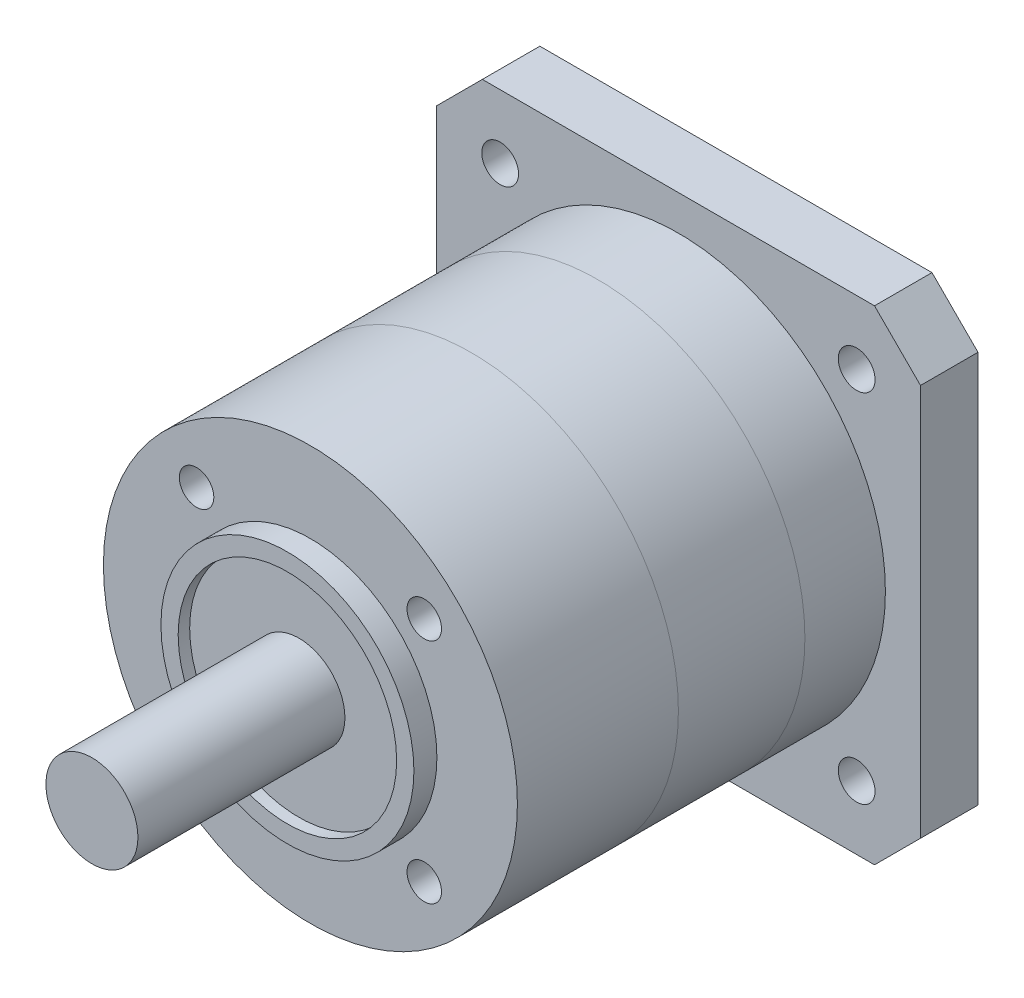
ISO-10303-21;
HEADER;
FILE_DESCRIPTION(('STEP AP214'),'2;1');
FILE_NAME('part.step','',(''),(''),'','','');
FILE_SCHEMA(('AUTOMOTIVE_DESIGN { 1 0 10303 214 1 1 1 1 }'));
ENDSEC;
DATA;
#1=APPLICATION_CONTEXT('core data for automotive mechanical design processes');
#2=APPLICATION_PROTOCOL_DEFINITION('international standard','automotive_design',2000,#1);
#3=PRODUCT_CONTEXT('',#1,'mechanical');
#4=PRODUCT('Part','Part','',(#3));
#5=PRODUCT_RELATED_PRODUCT_CATEGORY('part','',(#4));
#6=PRODUCT_DEFINITION_FORMATION('','',#4);
#7=PRODUCT_DEFINITION_CONTEXT('part definition',#1,'design');
#8=PRODUCT_DEFINITION('design','',#6,#7);
#9=PRODUCT_DEFINITION_SHAPE('','',#8);
#10=(LENGTH_UNIT() NAMED_UNIT(*) SI_UNIT(.MILLI.,.METRE.));
#11=(NAMED_UNIT(*) PLANE_ANGLE_UNIT() SI_UNIT($,.RADIAN.));
#12=(NAMED_UNIT(*) SI_UNIT($,.STERADIAN.) SOLID_ANGLE_UNIT());
#13=UNCERTAINTY_MEASURE_WITH_UNIT(LENGTH_MEASURE(1.E-05),#10,'distance_accuracy_value','');
#14=(GEOMETRIC_REPRESENTATION_CONTEXT(3) GLOBAL_UNCERTAINTY_ASSIGNED_CONTEXT((#13)) GLOBAL_UNIT_ASSIGNED_CONTEXT((#10,
#11,#12)) REPRESENTATION_CONTEXT('',''));
#15=CARTESIAN_POINT('',(0.,0.,0.));
#16=DIRECTION('',(0.,0.,1.));
#17=DIRECTION('',(1.,0.,0.));
#18=AXIS2_PLACEMENT_3D('',#15,#16,#17);
#19=CARTESIAN_POINT('',(0.,0.,56.));
#20=DIRECTION('',(0.,0.,-1.));
#21=DIRECTION('',(-1.,0.,0.));
#22=AXIS2_PLACEMENT_3D('',#19,#20,#21);
#23=CYLINDRICAL_SURFACE('',#22,4.);
#24=CARTESIAN_POINT('',(0.,0.,56.));
#25=DIRECTION('',(0.,0.,1.));
#26=DIRECTION('',(1.,0.,0.));
#27=AXIS2_PLACEMENT_3D('',#24,#25,#26);
#28=CIRCLE('',#27,4.);
#29=CARTESIAN_POINT('',(4.,0.,56.));
#30=VERTEX_POINT('',#29);
#31=EDGE_CURVE('E11',#30,#30,#28,.T.);
#32=ORIENTED_EDGE('',*,*,#31,.F.);
#33=EDGE_LOOP('',(#32));
#34=FACE_BOUND('',#33,.T.);
#35=CARTESIAN_POINT('',(0.,0.,37.));
#36=DIRECTION('',(0.,0.,1.));
#37=DIRECTION('',(1.,0.,0.));
#38=AXIS2_PLACEMENT_3D('',#35,#36,#37);
#39=CIRCLE('',#38,4.);
#40=CARTESIAN_POINT('',(4.,0.,37.));
#41=VERTEX_POINT('',#40);
#42=EDGE_CURVE('E51',#41,#41,#39,.T.);
#43=ORIENTED_EDGE('',*,*,#42,.T.);
#44=EDGE_LOOP('',(#43));
#45=FACE_BOUND('',#44,.T.);
#46=ADVANCED_FACE('F48',(#34,#45),#23,.T.);
#47=CARTESIAN_POINT('',(0.,0.,56.));
#48=DIRECTION('',(0.,0.,1.));
#49=DIRECTION('',(1.,0.,0.));
#50=AXIS2_PLACEMENT_3D('',#47,#48,#49);
#51=PLANE('',#50);
#52=ORIENTED_EDGE('',*,*,#31,.T.);
#53=EDGE_LOOP('',(#52));
#54=FACE_BOUND('',#53,.T.);
#55=ADVANCED_FACE('F63',(#54),#51,.T.);
#56=CARTESIAN_POINT('',(0.,0.,37.));
#57=DIRECTION('',(0.,0.,1.));
#58=DIRECTION('',(1.,0.,0.));
#59=AXIS2_PLACEMENT_3D('',#56,#57,#58);
#60=PLANE('',#59);
#61=ORIENTED_EDGE('',*,*,#42,.F.);
#62=EDGE_LOOP('',(#61));
#63=FACE_BOUND('',#62,.T.);
#64=ADVANCED_FACE('F61',(#63),#60,.F.);
#65=CLOSED_SHELL('',(#46,#55,#64));
#66=MANIFOLD_SOLID_BREP('B2',#65);
#67=CARTESIAN_POINT('',(0.,0.,124.911688245431));
#68=DIRECTION('',(0.,0.,-1.));
#69=DIRECTION('',(-1.,0.,0.));
#70=AXIS2_PLACEMENT_3D('',#67,#68,#69);
#71=CYLINDRICAL_SURFACE('',#70,18.);
#72=CARTESIAN_POINT('',(0.,0.,23.));
#73=DIRECTION('',(0.,0.,1.));
#74=DIRECTION('',(1.,0.,0.));
#75=AXIS2_PLACEMENT_3D('',#72,#73,#74);
#76=CIRCLE('',#75,18.);
#77=CARTESIAN_POINT('',(18.,0.,23.));
#78=VERTEX_POINT('',#77);
#79=EDGE_CURVE('E109',#78,#78,#76,.T.);
#80=ORIENTED_EDGE('',*,*,#79,.T.);
#81=EDGE_LOOP('',(#80));
#82=FACE_BOUND('',#81,.T.);
#83=CARTESIAN_POINT('',(0.,0.,37.));
#84=DIRECTION('',(0.,0.,1.));
#85=DIRECTION('',(1.,0.,0.));
#86=AXIS2_PLACEMENT_3D('',#83,#84,#85);
#87=CIRCLE('',#86,18.);
#88=CARTESIAN_POINT('',(18.,0.,37.));
#89=VERTEX_POINT('',#88);
#90=EDGE_CURVE('E101',#89,#89,#87,.T.);
#91=ORIENTED_EDGE('',*,*,#90,.F.);
#92=EDGE_LOOP('',(#91));
#93=FACE_BOUND('',#92,.T.);
#94=ADVANCED_FACE('F97',(#82,#93),#71,.T.);
#95=CARTESIAN_POINT('',(0.,0.,23.));
#96=DIRECTION('',(0.,0.,1.));
#97=DIRECTION('',(1.,0.,0.));
#98=AXIS2_PLACEMENT_3D('',#95,#96,#97);
#99=PLANE('',#98);
#100=ORIENTED_EDGE('',*,*,#79,.F.);
#101=EDGE_LOOP('',(#100));
#102=FACE_BOUND('',#101,.T.);
#103=ADVANCED_FACE('F164',(#102),#99,.F.);
#104=CARTESIAN_POINT('',(0.,0.,37.));
#105=DIRECTION('',(0.,0.,1.));
#106=DIRECTION('',(1.,0.,0.));
#107=AXIS2_PLACEMENT_3D('',#104,#105,#106);
#108=PLANE('',#107);
#109=CARTESIAN_POINT('',(-9.89949493661172,-9.89949493661161,37.));
#110=DIRECTION('',(0.,0.,1.));
#111=DIRECTION('',(1.,0.,0.));
#112=AXIS2_PLACEMENT_3D('',#109,#110,#111);
#113=CIRCLE('',#112,1.5);
#114=CARTESIAN_POINT('',(-8.39949493661172,-9.89949493661161,37.));
#115=VERTEX_POINT('',#114);
#116=EDGE_CURVE('E134',#115,#115,#113,.T.);
#117=ORIENTED_EDGE('',*,*,#116,.F.);
#118=EDGE_LOOP('',(#117));
#119=FACE_BOUND('',#118,.T.);
#120=CARTESIAN_POINT('',(9.89949493661161,-9.89949493661172,37.));
#121=DIRECTION('',(0.,0.,1.));
#122=DIRECTION('',(1.,0.,0.));
#123=AXIS2_PLACEMENT_3D('',#120,#121,#122);
#124=CIRCLE('',#123,1.5);
#125=CARTESIAN_POINT('',(11.3994949366116,-9.89949493661172,37.));
#126=VERTEX_POINT('',#125);
#127=EDGE_CURVE('E140',#126,#126,#124,.T.);
#128=ORIENTED_EDGE('',*,*,#127,.F.);
#129=EDGE_LOOP('',(#128));
#130=FACE_BOUND('',#129,.T.);
#131=CARTESIAN_POINT('',(9.89949493661172,9.89949493661161,37.));
#132=DIRECTION('',(0.,0.,1.));
#133=DIRECTION('',(1.,0.,0.));
#134=AXIS2_PLACEMENT_3D('',#131,#132,#133);
#135=CIRCLE('',#134,1.5);
#136=CARTESIAN_POINT('',(11.3994949366117,9.89949493661161,37.));
#137=VERTEX_POINT('',#136);
#138=EDGE_CURVE('E146',#137,#137,#135,.T.);
#139=ORIENTED_EDGE('',*,*,#138,.F.);
#140=EDGE_LOOP('',(#139));
#141=FACE_BOUND('',#140,.T.);
#142=CARTESIAN_POINT('',(-9.89949493661161,9.89949493661172,37.));
#143=DIRECTION('',(0.,0.,1.));
#144=DIRECTION('',(1.,0.,0.));
#145=AXIS2_PLACEMENT_3D('',#142,#143,#144);
#146=CIRCLE('',#145,1.5);
#147=CARTESIAN_POINT('',(-8.39949493661161,9.89949493661172,37.));
#148=VERTEX_POINT('',#147);
#149=EDGE_CURVE('E128',#148,#148,#146,.T.);
#150=ORIENTED_EDGE('',*,*,#149,.F.);
#151=EDGE_LOOP('',(#150));
#152=FACE_BOUND('',#151,.T.);
#153=CARTESIAN_POINT('',(0.,0.,37.));
#154=DIRECTION('',(0.,0.,1.));
#155=DIRECTION('',(1.,0.,0.));
#156=AXIS2_PLACEMENT_3D('',#153,#154,#155);
#157=CIRCLE('',#156,11.);
#158=CARTESIAN_POINT('',(11.,0.,37.));
#159=VERTEX_POINT('',#158);
#160=EDGE_CURVE('E47',#159,#159,#157,.T.);
#161=ORIENTED_EDGE('',*,*,#160,.F.);
#162=EDGE_LOOP('',(#161));
#163=FACE_BOUND('',#162,.T.);
#164=ORIENTED_EDGE('',*,*,#90,.T.);
#165=EDGE_LOOP('',(#164));
#166=FACE_BOUND('',#165,.T.);
#167=ADVANCED_FACE('F99',(#119,#130,#141,#152,#163,#166),#108,.T.);
#168=CARTESIAN_POINT('',(0.,0.,39.));
#169=DIRECTION('',(0.,0.,-1.));
#170=DIRECTION('',(-1.,0.,0.));
#171=AXIS2_PLACEMENT_3D('',#168,#169,#170);
#172=CYLINDRICAL_SURFACE('',#171,11.);
#173=CARTESIAN_POINT('',(0.,0.,39.));
#174=DIRECTION('',(0.,0.,1.));
#175=DIRECTION('',(1.,0.,0.));
#176=AXIS2_PLACEMENT_3D('',#173,#174,#175);
#177=CIRCLE('',#176,11.);
#178=CARTESIAN_POINT('',(11.,0.,39.));
#179=VERTEX_POINT('',#178);
#180=EDGE_CURVE('E111',#179,#179,#177,.T.);
#181=ORIENTED_EDGE('',*,*,#180,.F.);
#182=EDGE_LOOP('',(#181));
#183=FACE_BOUND('',#182,.T.);
#184=ORIENTED_EDGE('',*,*,#160,.T.);
#185=EDGE_LOOP('',(#184));
#186=FACE_BOUND('',#185,.T.);
#187=ADVANCED_FACE('F163',(#183,#186),#172,.T.);
#188=CARTESIAN_POINT('',(0.,0.,39.));
#189=DIRECTION('',(0.,0.,1.));
#190=DIRECTION('',(1.,0.,0.));
#191=AXIS2_PLACEMENT_3D('',#188,#189,#190);
#192=PLANE('',#191);
#193=CARTESIAN_POINT('',(0.,0.,39.));
#194=DIRECTION('',(0.,0.,1.));
#195=DIRECTION('',(1.,0.,0.));
#196=AXIS2_PLACEMENT_3D('',#193,#194,#195);
#197=CIRCLE('',#196,9.5);
#198=CARTESIAN_POINT('',(9.5,0.,39.));
#199=VERTEX_POINT('',#198);
#200=EDGE_CURVE('E121',#199,#199,#197,.T.);
#201=ORIENTED_EDGE('',*,*,#200,.F.);
#202=EDGE_LOOP('',(#201));
#203=FACE_BOUND('',#202,.T.);
#204=ORIENTED_EDGE('',*,*,#180,.T.);
#205=EDGE_LOOP('',(#204));
#206=FACE_BOUND('',#205,.T.);
#207=ADVANCED_FACE('F180',(#203,#206),#192,.T.);
#208=CARTESIAN_POINT('',(0.,0.,38.));
#209=DIRECTION('',(0.,0.,1.));
#210=DIRECTION('',(1.,0.,0.));
#211=AXIS2_PLACEMENT_3D('',#208,#209,#210);
#212=CYLINDRICAL_SURFACE('',#211,9.5);
#213=CARTESIAN_POINT('',(0.,0.,38.));
#214=DIRECTION('',(0.,0.,1.));
#215=DIRECTION('',(1.,0.,0.));
#216=AXIS2_PLACEMENT_3D('',#213,#214,#215);
#217=CIRCLE('',#216,9.5);
#218=CARTESIAN_POINT('',(9.5,0.,38.));
#219=VERTEX_POINT('',#218);
#220=EDGE_CURVE('E117',#219,#219,#217,.T.);
#221=ORIENTED_EDGE('',*,*,#220,.F.);
#222=EDGE_LOOP('',(#221));
#223=FACE_BOUND('',#222,.T.);
#224=ORIENTED_EDGE('',*,*,#200,.T.);
#225=EDGE_LOOP('',(#224));
#226=FACE_BOUND('',#225,.T.);
#227=ADVANCED_FACE('F184',(#223,#226),#212,.F.);
#228=CARTESIAN_POINT('',(0.,0.,38.));
#229=DIRECTION('',(0.,0.,1.));
#230=DIRECTION('',(1.,0.,0.));
#231=AXIS2_PLACEMENT_3D('',#228,#229,#230);
#232=PLANE('',#231);
#233=ORIENTED_EDGE('',*,*,#220,.T.);
#234=EDGE_LOOP('',(#233));
#235=FACE_BOUND('',#234,.T.);
#236=ADVANCED_FACE('F188',(#235),#232,.T.);
#237=CARTESIAN_POINT('',(-9.89949493661161,9.89949493661172,27.));
#238=DIRECTION('',(0.,0.,1.));
#239=DIRECTION('',(1.,0.,0.));
#240=AXIS2_PLACEMENT_3D('',#237,#238,#239);
#241=CYLINDRICAL_SURFACE('',#240,1.5);
#242=CARTESIAN_POINT('',(-9.89949493661161,9.89949493661172,27.));
#243=DIRECTION('',(0.,0.,1.));
#244=DIRECTION('',(1.,0.,0.));
#245=AXIS2_PLACEMENT_3D('',#242,#243,#244);
#246=CIRCLE('',#245,1.5);
#247=CARTESIAN_POINT('',(-8.39949493661161,9.89949493661172,27.));
#248=VERTEX_POINT('',#247);
#249=EDGE_CURVE('E126',#248,#248,#246,.T.);
#250=ORIENTED_EDGE('',*,*,#249,.F.);
#251=EDGE_LOOP('',(#250));
#252=FACE_BOUND('',#251,.T.);
#253=ORIENTED_EDGE('',*,*,#149,.T.);
#254=EDGE_LOOP('',(#253));
#255=FACE_BOUND('',#254,.T.);
#256=ADVANCED_FACE('F192',(#252,#255),#241,.F.);
#257=CARTESIAN_POINT('',(-9.89949493661161,9.89949493661172,27.));
#258=DIRECTION('',(0.,0.,1.));
#259=DIRECTION('',(1.,0.,0.));
#260=AXIS2_PLACEMENT_3D('',#257,#258,#259);
#261=PLANE('',#260);
#262=ORIENTED_EDGE('',*,*,#249,.T.);
#263=EDGE_LOOP('',(#262));
#264=FACE_BOUND('',#263,.T.);
#265=ADVANCED_FACE('F157',(#264),#261,.T.);
#266=CARTESIAN_POINT('',(9.89949493661172,9.89949493661161,27.));
#267=DIRECTION('',(0.,0.,1.));
#268=DIRECTION('',(1.,0.,0.));
#269=AXIS2_PLACEMENT_3D('',#266,#267,#268);
#270=CYLINDRICAL_SURFACE('',#269,1.5);
#271=CARTESIAN_POINT('',(9.89949493661172,9.89949493661161,27.));
#272=DIRECTION('',(0.,0.,1.));
#273=DIRECTION('',(1.,0.,0.));
#274=AXIS2_PLACEMENT_3D('',#271,#272,#273);
#275=CIRCLE('',#274,1.5);
#276=CARTESIAN_POINT('',(11.3994949366117,9.89949493661161,27.));
#277=VERTEX_POINT('',#276);
#278=EDGE_CURVE('E131',#277,#277,#275,.T.);
#279=ORIENTED_EDGE('',*,*,#278,.F.);
#280=EDGE_LOOP('',(#279));
#281=FACE_BOUND('',#280,.T.);
#282=ORIENTED_EDGE('',*,*,#138,.T.);
#283=EDGE_LOOP('',(#282));
#284=FACE_BOUND('',#283,.T.);
#285=ADVANCED_FACE('F154',(#281,#284),#270,.F.);
#286=CARTESIAN_POINT('',(9.89949493661172,9.89949493661161,27.));
#287=DIRECTION('',(0.,0.,1.));
#288=DIRECTION('',(1.,0.,0.));
#289=AXIS2_PLACEMENT_3D('',#286,#287,#288);
#290=PLANE('',#289);
#291=ORIENTED_EDGE('',*,*,#278,.T.);
#292=EDGE_LOOP('',(#291));
#293=FACE_BOUND('',#292,.T.);
#294=ADVANCED_FACE('F152',(#293),#290,.T.);
#295=CARTESIAN_POINT('',(9.89949493661161,-9.89949493661172,27.));
#296=DIRECTION('',(0.,0.,1.));
#297=DIRECTION('',(1.,0.,0.));
#298=AXIS2_PLACEMENT_3D('',#295,#296,#297);
#299=CYLINDRICAL_SURFACE('',#298,1.5);
#300=CARTESIAN_POINT('',(9.89949493661161,-9.89949493661172,27.));
#301=DIRECTION('',(0.,0.,1.));
#302=DIRECTION('',(1.,0.,0.));
#303=AXIS2_PLACEMENT_3D('',#300,#301,#302);
#304=CIRCLE('',#303,1.5);
#305=CARTESIAN_POINT('',(11.3994949366116,-9.89949493661172,27.));
#306=VERTEX_POINT('',#305);
#307=EDGE_CURVE('E143',#306,#306,#304,.T.);
#308=ORIENTED_EDGE('',*,*,#307,.F.);
#309=EDGE_LOOP('',(#308));
#310=FACE_BOUND('',#309,.T.);
#311=ORIENTED_EDGE('',*,*,#127,.T.);
#312=EDGE_LOOP('',(#311));
#313=FACE_BOUND('',#312,.T.);
#314=ADVANCED_FACE('F208',(#310,#313),#299,.F.);
#315=CARTESIAN_POINT('',(9.89949493661161,-9.89949493661172,27.));
#316=DIRECTION('',(0.,0.,1.));
#317=DIRECTION('',(1.,0.,0.));
#318=AXIS2_PLACEMENT_3D('',#315,#316,#317);
#319=PLANE('',#318);
#320=ORIENTED_EDGE('',*,*,#307,.T.);
#321=EDGE_LOOP('',(#320));
#322=FACE_BOUND('',#321,.T.);
#323=ADVANCED_FACE('F203',(#322),#319,.T.);
#324=CARTESIAN_POINT('',(-9.89949493661172,-9.89949493661161,27.));
#325=DIRECTION('',(0.,0.,1.));
#326=DIRECTION('',(1.,0.,0.));
#327=AXIS2_PLACEMENT_3D('',#324,#325,#326);
#328=CYLINDRICAL_SURFACE('',#327,1.5);
#329=CARTESIAN_POINT('',(-9.89949493661172,-9.89949493661161,27.));
#330=DIRECTION('',(0.,0.,1.));
#331=DIRECTION('',(1.,0.,0.));
#332=AXIS2_PLACEMENT_3D('',#329,#330,#331);
#333=CIRCLE('',#332,1.5);
#334=CARTESIAN_POINT('',(-8.39949493661172,-9.89949493661161,27.));
#335=VERTEX_POINT('',#334);
#336=EDGE_CURVE('E137',#335,#335,#333,.T.);
#337=ORIENTED_EDGE('',*,*,#336,.F.);
#338=EDGE_LOOP('',(#337));
#339=FACE_BOUND('',#338,.T.);
#340=ORIENTED_EDGE('',*,*,#116,.T.);
#341=EDGE_LOOP('',(#340));
#342=FACE_BOUND('',#341,.T.);
#343=ADVANCED_FACE('F199',(#339,#342),#328,.F.);
#344=CARTESIAN_POINT('',(-9.89949493661172,-9.89949493661161,27.));
#345=DIRECTION('',(0.,0.,1.));
#346=DIRECTION('',(1.,0.,0.));
#347=AXIS2_PLACEMENT_3D('',#344,#345,#346);
#348=PLANE('',#347);
#349=ORIENTED_EDGE('',*,*,#336,.T.);
#350=EDGE_LOOP('',(#349));
#351=FACE_BOUND('',#350,.T.);
#352=ADVANCED_FACE('F202',(#351),#348,.T.);
#353=CLOSED_SHELL('',(#94,#103,#167,#187,#207,#227,#236,#256,#265,#285,#294,#314,#323,#343,#352));
#354=MANIFOLD_SOLID_BREP('B6',#353);
#355=CARTESIAN_POINT('',(0.,0.,96.9116882454314));
#356=DIRECTION('',(0.,0.,-1.));
#357=DIRECTION('',(-1.,0.,0.));
#358=AXIS2_PLACEMENT_3D('',#355,#356,#357);
#359=CYLINDRICAL_SURFACE('',#358,18.);
#360=CARTESIAN_POINT('',(0.,0.,12.));
#361=DIRECTION('',(0.,0.,1.));
#362=DIRECTION('',(1.,0.,0.));
#363=AXIS2_PLACEMENT_3D('',#360,#361,#362);
#364=CIRCLE('',#363,18.);
#365=CARTESIAN_POINT('',(18.,0.,12.));
#366=VERTEX_POINT('',#365);
#367=EDGE_CURVE('E335',#366,#366,#364,.T.);
#368=ORIENTED_EDGE('',*,*,#367,.T.);
#369=EDGE_LOOP('',(#368));
#370=FACE_BOUND('',#369,.T.);
#371=CARTESIAN_POINT('',(0.,0.,23.));
#372=DIRECTION('',(0.,0.,1.));
#373=DIRECTION('',(1.,0.,0.));
#374=AXIS2_PLACEMENT_3D('',#371,#372,#373);
#375=CIRCLE('',#374,18.);
#376=CARTESIAN_POINT('',(18.,0.,23.));
#377=VERTEX_POINT('',#376);
#378=EDGE_CURVE('E96',#377,#377,#375,.T.);
#379=ORIENTED_EDGE('',*,*,#378,.F.);
#380=EDGE_LOOP('',(#379));
#381=FACE_BOUND('',#380,.T.);
#382=ADVANCED_FACE('F328',(#370,#381),#359,.T.);
#383=CARTESIAN_POINT('',(0.,0.,12.));
#384=DIRECTION('',(0.,0.,1.));
#385=DIRECTION('',(1.,0.,0.));
#386=AXIS2_PLACEMENT_3D('',#383,#384,#385);
#387=PLANE('',#386);
#388=ORIENTED_EDGE('',*,*,#367,.F.);
#389=EDGE_LOOP('',(#388));
#390=FACE_BOUND('',#389,.T.);
#391=ADVANCED_FACE('F343',(#390),#387,.F.);
#392=CARTESIAN_POINT('',(0.,0.,23.));
#393=DIRECTION('',(0.,0.,1.));
#394=DIRECTION('',(1.,0.,0.));
#395=AXIS2_PLACEMENT_3D('',#392,#393,#394);
#396=PLANE('',#395);
#397=ORIENTED_EDGE('',*,*,#378,.T.);
#398=EDGE_LOOP('',(#397));
#399=FACE_BOUND('',#398,.T.);
#400=ADVANCED_FACE('F330',(#399),#396,.T.);
#401=CLOSED_SHELL('',(#382,#391,#400));
#402=MANIFOLD_SOLID_BREP('B42',#401);
#403=CARTESIAN_POINT('',(-21.05,-21.05,5.));
#404=DIRECTION('',(1.,0.,0.));
#405=DIRECTION('',(0.,0.,-1.));
#406=AXIS2_PLACEMENT_3D('',#403,#404,#405);
#407=PLANE('',#406);
#408=DIRECTION('',(0.,-1.,0.));
#409=VECTOR('',#408,1.);
#410=CARTESIAN_POINT('',(-21.05,-21.05,0.));
#411=LINE('',#410,#409);
#412=CARTESIAN_POINT('',(-21.05,17.05,0.));
#413=VERTEX_POINT('',#412);
#414=CARTESIAN_POINT('',(-21.05,-17.05,0.));
#415=VERTEX_POINT('',#414);
#416=EDGE_CURVE('E473',#413,#415,#411,.T.);
#417=ORIENTED_EDGE('',*,*,#416,.T.);
#418=DIRECTION('',(0.,0.,1.));
#419=VECTOR('',#418,1.);
#420=CARTESIAN_POINT('',(-21.05,-17.05,5.));
#421=LINE('',#420,#419);
#422=CARTESIAN_POINT('',(-21.05,-17.05,5.));
#423=VERTEX_POINT('',#422);
#424=EDGE_CURVE('E506',#415,#423,#421,.T.);
#425=ORIENTED_EDGE('',*,*,#424,.T.);
#426=DIRECTION('',(0.,-1.,0.));
#427=VECTOR('',#426,1.);
#428=CARTESIAN_POINT('',(-21.05,-21.05,5.));
#429=LINE('',#428,#427);
#430=CARTESIAN_POINT('',(-21.05,17.05,5.));
#431=VERTEX_POINT('',#430);
#432=EDGE_CURVE('E471',#431,#423,#429,.T.);
#433=ORIENTED_EDGE('',*,*,#432,.F.);
#434=DIRECTION('',(0.,0.,-1.));
#435=VECTOR('',#434,1.);
#436=CARTESIAN_POINT('',(-21.05,17.05,5.));
#437=LINE('',#436,#435);
#438=EDGE_CURVE('E502',#431,#413,#437,.T.);
#439=ORIENTED_EDGE('',*,*,#438,.T.);
#440=EDGE_LOOP('',(#417,#425,#433,#439));
#441=FACE_BOUND('',#440,.T.);
#442=ADVANCED_FACE('F370',(#441),#407,.F.);
#443=CARTESIAN_POINT('',(21.05,-21.05,5.));
#444=DIRECTION('',(0.,1.,0.));
#445=DIRECTION('',(-1.,0.,0.));
#446=AXIS2_PLACEMENT_3D('',#443,#444,#445);
#447=PLANE('',#446);
#448=DIRECTION('',(1.,0.,0.));
#449=VECTOR('',#448,1.);
#450=CARTESIAN_POINT('',(21.05,-21.05,0.));
#451=LINE('',#450,#449);
#452=CARTESIAN_POINT('',(-17.05,-21.05,0.));
#453=VERTEX_POINT('',#452);
#454=CARTESIAN_POINT('',(17.05,-21.05,0.));
#455=VERTEX_POINT('',#454);
#456=EDGE_CURVE('E467',#453,#455,#451,.T.);
#457=ORIENTED_EDGE('',*,*,#456,.T.);
#458=DIRECTION('',(0.,0.,1.));
#459=VECTOR('',#458,1.);
#460=CARTESIAN_POINT('',(17.05,-21.05,5.));
#461=LINE('',#460,#459);
#462=CARTESIAN_POINT('',(17.05,-21.05,5.));
#463=VERTEX_POINT('',#462);
#464=EDGE_CURVE('E442',#455,#463,#461,.T.);
#465=ORIENTED_EDGE('',*,*,#464,.T.);
#466=DIRECTION('',(1.,0.,0.));
#467=VECTOR('',#466,1.);
#468=CARTESIAN_POINT('',(21.05,-21.05,5.));
#469=LINE('',#468,#467);
#470=CARTESIAN_POINT('',(-17.05,-21.05,5.));
#471=VERTEX_POINT('',#470);
#472=EDGE_CURVE('E517',#471,#463,#469,.T.);
#473=ORIENTED_EDGE('',*,*,#472,.F.);
#474=DIRECTION('',(0.,0.,-1.));
#475=VECTOR('',#474,1.);
#476=CARTESIAN_POINT('',(-17.05,-21.05,5.));
#477=LINE('',#476,#475);
#478=EDGE_CURVE('E448',#471,#453,#477,.T.);
#479=ORIENTED_EDGE('',*,*,#478,.T.);
#480=EDGE_LOOP('',(#457,#465,#473,#479));
#481=FACE_BOUND('',#480,.T.);
#482=ADVANCED_FACE('F619',(#481),#447,.F.);
#483=CARTESIAN_POINT('',(21.05,-21.05,5.));
#484=DIRECTION('',(-1.,0.,0.));
#485=DIRECTION('',(0.,0.,1.));
#486=AXIS2_PLACEMENT_3D('',#483,#484,#485);
#487=PLANE('',#486);
#488=DIRECTION('',(0.,1.,0.));
#489=VECTOR('',#488,1.);
#490=CARTESIAN_POINT('',(21.05,-21.05,5.));
#491=LINE('',#490,#489);
#492=CARTESIAN_POINT('',(21.05,-17.05,5.));
#493=VERTEX_POINT('',#492);
#494=CARTESIAN_POINT('',(21.05,17.05,5.));
#495=VERTEX_POINT('',#494);
#496=EDGE_CURVE('E457',#493,#495,#491,.T.);
#497=ORIENTED_EDGE('',*,*,#496,.F.);
#498=DIRECTION('',(0.,0.,-1.));
#499=VECTOR('',#498,1.);
#500=CARTESIAN_POINT('',(21.05,-17.05,5.));
#501=LINE('',#500,#499);
#502=CARTESIAN_POINT('',(21.05,-17.05,0.));
#503=VERTEX_POINT('',#502);
#504=EDGE_CURVE('E441',#493,#503,#501,.T.);
#505=ORIENTED_EDGE('',*,*,#504,.T.);
#506=DIRECTION('',(0.,1.,0.));
#507=VECTOR('',#506,1.);
#508=CARTESIAN_POINT('',(21.05,-21.05,0.));
#509=LINE('',#508,#507);
#510=CARTESIAN_POINT('',(21.05,17.05,0.));
#511=VERTEX_POINT('',#510);
#512=EDGE_CURVE('E455',#503,#511,#509,.T.);
#513=ORIENTED_EDGE('',*,*,#512,.T.);
#514=DIRECTION('',(0.,0.,1.));
#515=VECTOR('',#514,1.);
#516=CARTESIAN_POINT('',(21.05,17.05,5.));
#517=LINE('',#516,#515);
#518=EDGE_CURVE('E460',#511,#495,#517,.T.);
#519=ORIENTED_EDGE('',*,*,#518,.T.);
#520=EDGE_LOOP('',(#497,#505,#513,#519));
#521=FACE_BOUND('',#520,.T.);
#522=ADVANCED_FACE('F454',(#521),#487,.F.);
#523=CARTESIAN_POINT('',(21.05,21.05,5.));
#524=DIRECTION('',(0.,-1.,0.));
#525=DIRECTION('',(1.,0.,0.));
#526=AXIS2_PLACEMENT_3D('',#523,#524,#525);
#527=PLANE('',#526);
#528=DIRECTION('',(-1.,0.,0.));
#529=VECTOR('',#528,1.);
#530=CARTESIAN_POINT('',(21.05,21.05,5.));
#531=LINE('',#530,#529);
#532=CARTESIAN_POINT('',(17.05,21.05,5.));
#533=VERTEX_POINT('',#532);
#534=CARTESIAN_POINT('',(-17.05,21.05,5.));
#535=VERTEX_POINT('',#534);
#536=EDGE_CURVE('E512',#533,#535,#531,.T.);
#537=ORIENTED_EDGE('',*,*,#536,.F.);
#538=DIRECTION('',(0.,0.,-1.));
#539=VECTOR('',#538,1.);
#540=CARTESIAN_POINT('',(17.05,21.05,5.));
#541=LINE('',#540,#539);
#542=CARTESIAN_POINT('',(17.05,21.05,0.));
#543=VERTEX_POINT('',#542);
#544=EDGE_CURVE('E326',#533,#543,#541,.T.);
#545=ORIENTED_EDGE('',*,*,#544,.T.);
#546=DIRECTION('',(-1.,0.,0.));
#547=VECTOR('',#546,1.);
#548=CARTESIAN_POINT('',(21.05,21.05,0.));
#549=LINE('',#548,#547);
#550=CARTESIAN_POINT('',(-17.05,21.05,0.));
#551=VERTEX_POINT('',#550);
#552=EDGE_CURVE('E466',#543,#551,#549,.T.);
#553=ORIENTED_EDGE('',*,*,#552,.T.);
#554=DIRECTION('',(0.,0.,1.));
#555=VECTOR('',#554,1.);
#556=CARTESIAN_POINT('',(-17.05,21.05,5.));
#557=LINE('',#556,#555);
#558=EDGE_CURVE('E379',#551,#535,#557,.T.);
#559=ORIENTED_EDGE('',*,*,#558,.T.);
#560=EDGE_LOOP('',(#537,#545,#553,#559));
#561=FACE_BOUND('',#560,.T.);
#562=ADVANCED_FACE('F641',(#561),#527,.F.);
#563=CARTESIAN_POINT('',(0.,0.,5.));
#564=DIRECTION('',(0.,0.,1.));
#565=DIRECTION('',(1.,0.,0.));
#566=AXIS2_PLACEMENT_3D('',#563,#564,#565);
#567=PLANE('',#566);
#568=CARTESIAN_POINT('',(15.5,-15.5,5.));
#569=DIRECTION('',(0.,0.,1.));
#570=DIRECTION('',(1.,0.,0.));
#571=AXIS2_PLACEMENT_3D('',#568,#569,#570);
#572=CIRCLE('',#571,1.6);
#573=CARTESIAN_POINT('',(17.1,-15.5,5.));
#574=VERTEX_POINT('',#573);
#575=EDGE_CURVE('E549',#574,#574,#572,.F.);
#576=ORIENTED_EDGE('',*,*,#575,.T.);
#577=EDGE_LOOP('',(#576));
#578=FACE_BOUND('',#577,.T.);
#579=CARTESIAN_POINT('',(-15.5,-15.5,5.));
#580=DIRECTION('',(0.,0.,1.));
#581=DIRECTION('',(1.,0.,0.));
#582=AXIS2_PLACEMENT_3D('',#579,#580,#581);
#583=CIRCLE('',#582,1.6);
#584=CARTESIAN_POINT('',(-13.9,-15.5,5.));
#585=VERTEX_POINT('',#584);
#586=EDGE_CURVE('E558',#585,#585,#583,.F.);
#587=ORIENTED_EDGE('',*,*,#586,.T.);
#588=EDGE_LOOP('',(#587));
#589=FACE_BOUND('',#588,.T.);
#590=CARTESIAN_POINT('',(-15.5,15.5,5.));
#591=DIRECTION('',(0.,0.,1.));
#592=DIRECTION('',(1.,0.,0.));
#593=AXIS2_PLACEMENT_3D('',#590,#591,#592);
#594=CIRCLE('',#593,1.6);
#595=CARTESIAN_POINT('',(-13.9,15.5,5.));
#596=VERTEX_POINT('',#595);
#597=EDGE_CURVE('E566',#596,#596,#594,.F.);
#598=ORIENTED_EDGE('',*,*,#597,.T.);
#599=EDGE_LOOP('',(#598));
#600=FACE_BOUND('',#599,.T.);
#601=CARTESIAN_POINT('',(15.5,15.5,5.));
#602=DIRECTION('',(0.,0.,1.));
#603=DIRECTION('',(1.,0.,0.));
#604=AXIS2_PLACEMENT_3D('',#601,#602,#603);
#605=CIRCLE('',#604,1.6);
#606=CARTESIAN_POINT('',(17.1,15.5,5.));
#607=VERTEX_POINT('',#606);
#608=EDGE_CURVE('E540',#607,#607,#605,.F.);
#609=ORIENTED_EDGE('',*,*,#608,.T.);
#610=EDGE_LOOP('',(#609));
#611=FACE_BOUND('',#610,.T.);
#612=CARTESIAN_POINT('',(0.,0.,5.));
#613=DIRECTION('',(0.,0.,1.));
#614=DIRECTION('',(1.,0.,0.));
#615=AXIS2_PLACEMENT_3D('',#612,#613,#614);
#616=CIRCLE('',#615,18.);
#617=CARTESIAN_POINT('',(18.,0.,5.));
#618=VERTEX_POINT('',#617);
#619=EDGE_CURVE('E478',#618,#618,#616,.T.);
#620=ORIENTED_EDGE('',*,*,#619,.F.);
#621=EDGE_LOOP('',(#620));
#622=FACE_BOUND('',#621,.T.);
#623=ORIENTED_EDGE('',*,*,#472,.T.);
#624=DIRECTION('',(-0.707106781186549,-0.707106781186546,0.));
#625=VECTOR('',#624,1.);
#626=CARTESIAN_POINT('',(19.05,-19.05,5.));
#627=LINE('',#626,#625);
#628=EDGE_CURVE('E499',#463,#493,#627,.F.);
#629=ORIENTED_EDGE('',*,*,#628,.T.);
#630=ORIENTED_EDGE('',*,*,#496,.T.);
#631=DIRECTION('',(0.707106781186546,-0.707106781186549,0.));
#632=VECTOR('',#631,1.);
#633=CARTESIAN_POINT('',(19.05,19.05,5.));
#634=LINE('',#633,#632);
#635=EDGE_CURVE('E392',#495,#533,#634,.F.);
#636=ORIENTED_EDGE('',*,*,#635,.T.);
#637=ORIENTED_EDGE('',*,*,#536,.T.);
#638=DIRECTION('',(0.707106781186549,0.707106781186546,0.));
#639=VECTOR('',#638,1.);
#640=CARTESIAN_POINT('',(-19.05,19.05,5.));
#641=LINE('',#640,#639);
#642=EDGE_CURVE('E491',#535,#431,#641,.F.);
#643=ORIENTED_EDGE('',*,*,#642,.T.);
#644=ORIENTED_EDGE('',*,*,#432,.T.);
#645=DIRECTION('',(-0.707106781186546,0.707106781186549,0.));
#646=VECTOR('',#645,1.);
#647=CARTESIAN_POINT('',(-19.05,-19.05,5.));
#648=LINE('',#647,#646);
#649=EDGE_CURVE('E496',#423,#471,#648,.F.);
#650=ORIENTED_EDGE('',*,*,#649,.T.);
#651=EDGE_LOOP('',(#623,#629,#630,#636,#637,#643,#644,#650));
#652=FACE_BOUND('',#651,.T.);
#653=ADVANCED_FACE('F592',(#578,#589,#600,#611,#622,#652),#567,.T.);
#654=CARTESIAN_POINT('',(0.,0.,0.));
#655=DIRECTION('',(0.,0.,1.));
#656=DIRECTION('',(1.,0.,0.));
#657=AXIS2_PLACEMENT_3D('',#654,#655,#656);
#658=PLANE('',#657);
#659=CARTESIAN_POINT('',(0.,0.,0.));
#660=DIRECTION('',(0.,0.,-1.));
#661=DIRECTION('',(-1.,0.,0.));
#662=AXIS2_PLACEMENT_3D('',#659,#660,#661);
#663=CIRCLE('',#662,11.);
#664=CARTESIAN_POINT('',(-11.,0.,0.));
#665=VERTEX_POINT('',#664);
#666=EDGE_CURVE('E573',#665,#665,#663,.T.);
#667=ORIENTED_EDGE('',*,*,#666,.F.);
#668=EDGE_LOOP('',(#667));
#669=FACE_BOUND('',#668,.T.);
#670=CARTESIAN_POINT('',(15.5,-15.5,0.));
#671=DIRECTION('',(0.,0.,-1.));
#672=DIRECTION('',(-1.,0.,0.));
#673=AXIS2_PLACEMENT_3D('',#670,#671,#672);
#674=CIRCLE('',#673,1.6);
#675=CARTESIAN_POINT('',(13.9,-15.5,0.));
#676=VERTEX_POINT('',#675);
#677=EDGE_CURVE('E553',#676,#676,#674,.T.);
#678=ORIENTED_EDGE('',*,*,#677,.F.);
#679=EDGE_LOOP('',(#678));
#680=FACE_BOUND('',#679,.T.);
#681=CARTESIAN_POINT('',(-15.5,-15.5,0.));
#682=DIRECTION('',(0.,0.,-1.));
#683=DIRECTION('',(-1.,0.,0.));
#684=AXIS2_PLACEMENT_3D('',#681,#682,#683);
#685=CIRCLE('',#684,1.6);
#686=CARTESIAN_POINT('',(-17.1,-15.5,0.));
#687=VERTEX_POINT('',#686);
#688=EDGE_CURVE('E562',#687,#687,#685,.T.);
#689=ORIENTED_EDGE('',*,*,#688,.F.);
#690=EDGE_LOOP('',(#689));
#691=FACE_BOUND('',#690,.T.);
#692=CARTESIAN_POINT('',(-15.5,15.5,0.));
#693=DIRECTION('',(0.,0.,-1.));
#694=DIRECTION('',(-1.,0.,0.));
#695=AXIS2_PLACEMENT_3D('',#692,#693,#694);
#696=CIRCLE('',#695,1.6);
#697=CARTESIAN_POINT('',(-17.1,15.5,0.));
#698=VERTEX_POINT('',#697);
#699=EDGE_CURVE('E546',#698,#698,#696,.T.);
#700=ORIENTED_EDGE('',*,*,#699,.F.);
#701=EDGE_LOOP('',(#700));
#702=FACE_BOUND('',#701,.T.);
#703=CARTESIAN_POINT('',(15.5,15.5,0.));
#704=DIRECTION('',(0.,0.,-1.));
#705=DIRECTION('',(-1.,0.,0.));
#706=AXIS2_PLACEMENT_3D('',#703,#704,#705);
#707=CIRCLE('',#706,1.6);
#708=CARTESIAN_POINT('',(13.9,15.5,0.));
#709=VERTEX_POINT('',#708);
#710=EDGE_CURVE('E535',#709,#709,#707,.T.);
#711=ORIENTED_EDGE('',*,*,#710,.F.);
#712=EDGE_LOOP('',(#711));
#713=FACE_BOUND('',#712,.T.);
#714=ORIENTED_EDGE('',*,*,#512,.F.);
#715=DIRECTION('',(0.707106781186549,0.707106781186546,0.));
#716=VECTOR('',#715,1.);
#717=CARTESIAN_POINT('',(21.05,-17.05,0.));
#718=LINE('',#717,#716);
#719=EDGE_CURVE('E437',#503,#455,#718,.F.);
#720=ORIENTED_EDGE('',*,*,#719,.T.);
#721=ORIENTED_EDGE('',*,*,#456,.F.);
#722=DIRECTION('',(0.707106781186546,-0.707106781186549,0.));
#723=VECTOR('',#722,1.);
#724=CARTESIAN_POINT('',(-17.05,-21.05,0.));
#725=LINE('',#724,#723);
#726=EDGE_CURVE('E449',#453,#415,#725,.F.);
#727=ORIENTED_EDGE('',*,*,#726,.T.);
#728=ORIENTED_EDGE('',*,*,#416,.F.);
#729=DIRECTION('',(-0.707106781186549,-0.707106781186546,0.));
#730=VECTOR('',#729,1.);
#731=CARTESIAN_POINT('',(-21.05,17.05,0.));
#732=LINE('',#731,#730);
#733=EDGE_CURVE('E459',#413,#551,#732,.F.);
#734=ORIENTED_EDGE('',*,*,#733,.T.);
#735=ORIENTED_EDGE('',*,*,#552,.F.);
#736=DIRECTION('',(-0.707106781186546,0.707106781186549,0.));
#737=VECTOR('',#736,1.);
#738=CARTESIAN_POINT('',(17.05,21.05,0.));
#739=LINE('',#738,#737);
#740=EDGE_CURVE('E464',#543,#511,#739,.F.);
#741=ORIENTED_EDGE('',*,*,#740,.T.);
#742=EDGE_LOOP('',(#714,#720,#721,#727,#728,#734,#735,#741));
#743=FACE_BOUND('',#742,.T.);
#744=ADVANCED_FACE('F462',(#669,#680,#691,#702,#713,#743),#658,.F.);
#745=CARTESIAN_POINT('',(0.,0.,74.9116882454314));
#746=DIRECTION('',(0.,0.,-1.));
#747=DIRECTION('',(-1.,0.,0.));
#748=AXIS2_PLACEMENT_3D('',#745,#746,#747);
#749=CYLINDRICAL_SURFACE('',#748,18.);
#750=ORIENTED_EDGE('',*,*,#619,.T.);
#751=EDGE_LOOP('',(#750));
#752=FACE_BOUND('',#751,.T.);
#753=CARTESIAN_POINT('',(0.,0.,12.));
#754=DIRECTION('',(0.,0.,1.));
#755=DIRECTION('',(1.,0.,0.));
#756=AXIS2_PLACEMENT_3D('',#753,#754,#755);
#757=CIRCLE('',#756,18.);
#758=CARTESIAN_POINT('',(18.,0.,12.));
#759=VERTEX_POINT('',#758);
#760=EDGE_CURVE('E527',#759,#759,#757,.T.);
#761=ORIENTED_EDGE('',*,*,#760,.F.);
#762=EDGE_LOOP('',(#761));
#763=FACE_BOUND('',#762,.T.);
#764=ADVANCED_FACE('F591',(#752,#763),#749,.T.);
#765=CARTESIAN_POINT('',(0.,0.,12.));
#766=DIRECTION('',(0.,0.,1.));
#767=DIRECTION('',(1.,0.,0.));
#768=AXIS2_PLACEMENT_3D('',#765,#766,#767);
#769=PLANE('',#768);
#770=ORIENTED_EDGE('',*,*,#760,.T.);
#771=EDGE_LOOP('',(#770));
#772=FACE_BOUND('',#771,.T.);
#773=ADVANCED_FACE('F614',(#772),#769,.T.);
#774=CARTESIAN_POINT('',(15.5,15.5,56.001));
#775=DIRECTION('',(0.,0.,-1.));
#776=DIRECTION('',(-1.,0.,0.));
#777=AXIS2_PLACEMENT_3D('',#774,#775,#776);
#778=CYLINDRICAL_SURFACE('',#777,1.6);
#779=ORIENTED_EDGE('',*,*,#608,.F.);
#780=EDGE_LOOP('',(#779));
#781=FACE_BOUND('',#780,.T.);
#782=ORIENTED_EDGE('',*,*,#710,.T.);
#783=EDGE_LOOP('',(#782));
#784=FACE_BOUND('',#783,.T.);
#785=ADVANCED_FACE('F604',(#781,#784),#778,.F.);
#786=CARTESIAN_POINT('',(-15.5,15.5,56.001));
#787=DIRECTION('',(0.,0.,-1.));
#788=DIRECTION('',(-1.,0.,0.));
#789=AXIS2_PLACEMENT_3D('',#786,#787,#788);
#790=CYLINDRICAL_SURFACE('',#789,1.6);
#791=ORIENTED_EDGE('',*,*,#597,.F.);
#792=EDGE_LOOP('',(#791));
#793=FACE_BOUND('',#792,.T.);
#794=ORIENTED_EDGE('',*,*,#699,.T.);
#795=EDGE_LOOP('',(#794));
#796=FACE_BOUND('',#795,.T.);
#797=ADVANCED_FACE('F601',(#793,#796),#790,.F.);
#798=CARTESIAN_POINT('',(-15.5,-15.5,56.001));
#799=DIRECTION('',(0.,0.,-1.));
#800=DIRECTION('',(-1.,0.,0.));
#801=AXIS2_PLACEMENT_3D('',#798,#799,#800);
#802=CYLINDRICAL_SURFACE('',#801,1.6);
#803=ORIENTED_EDGE('',*,*,#586,.F.);
#804=EDGE_LOOP('',(#803));
#805=FACE_BOUND('',#804,.T.);
#806=ORIENTED_EDGE('',*,*,#688,.T.);
#807=EDGE_LOOP('',(#806));
#808=FACE_BOUND('',#807,.T.);
#809=ADVANCED_FACE('F603',(#805,#808),#802,.F.);
#810=CARTESIAN_POINT('',(15.5,-15.5,56.001));
#811=DIRECTION('',(0.,0.,-1.));
#812=DIRECTION('',(-1.,0.,0.));
#813=AXIS2_PLACEMENT_3D('',#810,#811,#812);
#814=CYLINDRICAL_SURFACE('',#813,1.6);
#815=ORIENTED_EDGE('',*,*,#575,.F.);
#816=EDGE_LOOP('',(#815));
#817=FACE_BOUND('',#816,.T.);
#818=ORIENTED_EDGE('',*,*,#677,.T.);
#819=EDGE_LOOP('',(#818));
#820=FACE_BOUND('',#819,.T.);
#821=ADVANCED_FACE('F611',(#817,#820),#814,.F.);
#822=CARTESIAN_POINT('',(21.05,-17.05,5.));
#823=DIRECTION('',(-0.707106781186546,0.707106781186549,0.));
#824=DIRECTION('',(0.,0.,-1.));
#825=AXIS2_PLACEMENT_3D('',#822,#823,#824);
#826=PLANE('',#825);
#827=ORIENTED_EDGE('',*,*,#628,.F.);
#828=ORIENTED_EDGE('',*,*,#464,.F.);
#829=ORIENTED_EDGE('',*,*,#719,.F.);
#830=ORIENTED_EDGE('',*,*,#504,.F.);
#831=EDGE_LOOP('',(#827,#828,#829,#830));
#832=FACE_BOUND('',#831,.T.);
#833=ADVANCED_FACE('F440',(#832),#826,.F.);
#834=CARTESIAN_POINT('',(-17.05,-21.05,5.));
#835=DIRECTION('',(0.707106781186549,0.707106781186546,0.));
#836=DIRECTION('',(0.,0.,-1.));
#837=AXIS2_PLACEMENT_3D('',#834,#835,#836);
#838=PLANE('',#837);
#839=ORIENTED_EDGE('',*,*,#649,.F.);
#840=ORIENTED_EDGE('',*,*,#424,.F.);
#841=ORIENTED_EDGE('',*,*,#726,.F.);
#842=ORIENTED_EDGE('',*,*,#478,.F.);
#843=EDGE_LOOP('',(#839,#840,#841,#842));
#844=FACE_BOUND('',#843,.T.);
#845=ADVANCED_FACE('F630',(#844),#838,.F.);
#846=CARTESIAN_POINT('',(17.05,21.05,5.));
#847=DIRECTION('',(-0.707106781186549,-0.707106781186546,0.));
#848=DIRECTION('',(0.,0.,-1.));
#849=AXIS2_PLACEMENT_3D('',#846,#847,#848);
#850=PLANE('',#849);
#851=ORIENTED_EDGE('',*,*,#635,.F.);
#852=ORIENTED_EDGE('',*,*,#518,.F.);
#853=ORIENTED_EDGE('',*,*,#740,.F.);
#854=ORIENTED_EDGE('',*,*,#544,.F.);
#855=EDGE_LOOP('',(#851,#852,#853,#854));
#856=FACE_BOUND('',#855,.T.);
#857=ADVANCED_FACE('F632',(#856),#850,.F.);
#858=CARTESIAN_POINT('',(-21.05,17.05,5.));
#859=DIRECTION('',(0.707106781186546,-0.707106781186549,0.));
#860=DIRECTION('',(0.,0.,-1.));
#861=AXIS2_PLACEMENT_3D('',#858,#859,#860);
#862=PLANE('',#861);
#863=ORIENTED_EDGE('',*,*,#642,.F.);
#864=ORIENTED_EDGE('',*,*,#558,.F.);
#865=ORIENTED_EDGE('',*,*,#733,.F.);
#866=ORIENTED_EDGE('',*,*,#438,.F.);
#867=EDGE_LOOP('',(#863,#864,#865,#866));
#868=FACE_BOUND('',#867,.T.);
#869=ADVANCED_FACE('F372',(#868),#862,.F.);
#870=CARTESIAN_POINT('',(0.,0.,1.5));
#871=DIRECTION('',(0.,0.,-1.));
#872=DIRECTION('',(-1.,0.,0.));
#873=AXIS2_PLACEMENT_3D('',#870,#871,#872);
#874=CYLINDRICAL_SURFACE('',#873,11.);
#875=CARTESIAN_POINT('',(0.,0.,1.5));
#876=DIRECTION('',(0.,0.,-1.));
#877=DIRECTION('',(-1.,0.,0.));
#878=AXIS2_PLACEMENT_3D('',#875,#876,#877);
#879=CIRCLE('',#878,11.);
#880=CARTESIAN_POINT('',(-11.,0.,1.5));
#881=VERTEX_POINT('',#880);
#882=EDGE_CURVE('E554',#881,#881,#879,.T.);
#883=ORIENTED_EDGE('',*,*,#882,.F.);
#884=EDGE_LOOP('',(#883));
#885=FACE_BOUND('',#884,.T.);
#886=ORIENTED_EDGE('',*,*,#666,.T.);
#887=EDGE_LOOP('',(#886));
#888=FACE_BOUND('',#887,.T.);
#889=ADVANCED_FACE('F583',(#885,#888),#874,.F.);
#890=CARTESIAN_POINT('',(0.,0.,1.5));
#891=DIRECTION('',(0.,0.,-1.));
#892=DIRECTION('',(-1.,0.,0.));
#893=AXIS2_PLACEMENT_3D('',#890,#891,#892);
#894=PLANE('',#893);
#895=ORIENTED_EDGE('',*,*,#882,.T.);
#896=EDGE_LOOP('',(#895));
#897=FACE_BOUND('',#896,.T.);
#898=ADVANCED_FACE('F581',(#897),#894,.T.);
#899=CLOSED_SHELL('',(#442,#482,#522,#562,#653,#744,#764,#773,#785,#797,#809,#821,#833,#845,
#857,#869,#889,#898));
#900=MANIFOLD_SOLID_BREP('B91',#899);
#901=ADVANCED_BREP_SHAPE_REPRESENTATION('',(#18,#66,#354,#402,#900),#14);
#902=SHAPE_DEFINITION_REPRESENTATION(#9,#901);
ENDSEC;
END-ISO-10303-21;
